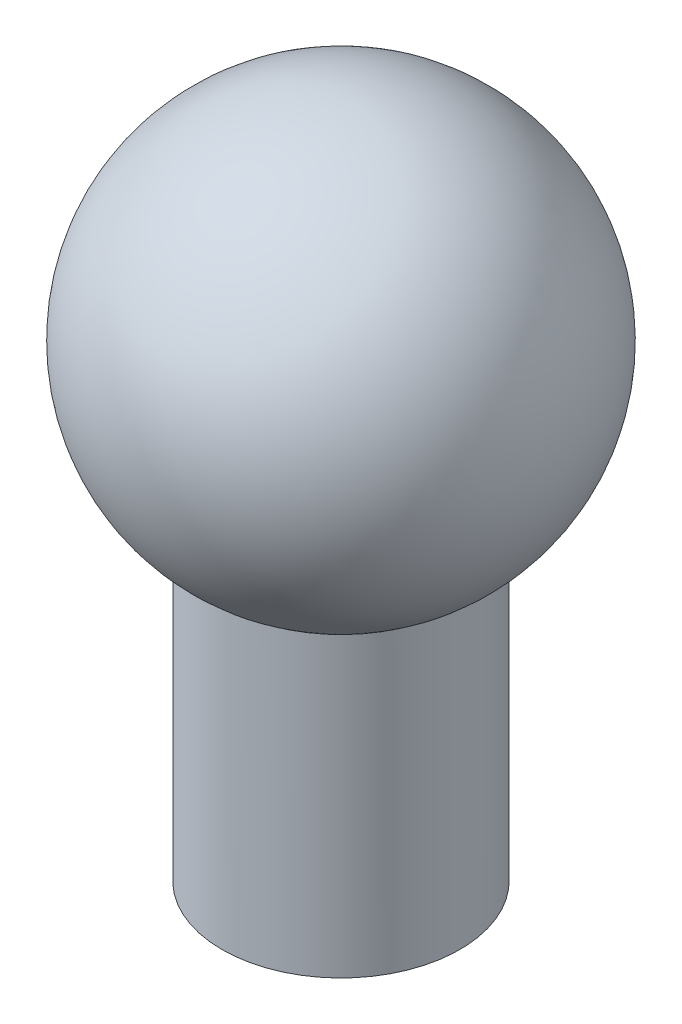
ISO-10303-21;
HEADER;
FILE_DESCRIPTION(('STEP AP214'),'2;1');
FILE_NAME('part.step','',(''),(''),'','','');
FILE_SCHEMA(('AUTOMOTIVE_DESIGN { 1 0 10303 214 1 1 1 1 }'));
ENDSEC;
DATA;
#1=APPLICATION_CONTEXT('core data for automotive mechanical design processes');
#2=APPLICATION_PROTOCOL_DEFINITION('international standard','automotive_design',2000,#1);
#3=PRODUCT_CONTEXT('',#1,'mechanical');
#4=PRODUCT('Part','Part','',(#3));
#5=PRODUCT_RELATED_PRODUCT_CATEGORY('part','',(#4));
#6=PRODUCT_DEFINITION_FORMATION('','',#4);
#7=PRODUCT_DEFINITION_CONTEXT('part definition',#1,'design');
#8=PRODUCT_DEFINITION('design','',#6,#7);
#9=PRODUCT_DEFINITION_SHAPE('','',#8);
#10=(LENGTH_UNIT() NAMED_UNIT(*) SI_UNIT(.MILLI.,.METRE.));
#11=(NAMED_UNIT(*) PLANE_ANGLE_UNIT() SI_UNIT($,.RADIAN.));
#12=(NAMED_UNIT(*) SI_UNIT($,.STERADIAN.) SOLID_ANGLE_UNIT());
#13=UNCERTAINTY_MEASURE_WITH_UNIT(LENGTH_MEASURE(1.E-05),#10,'distance_accuracy_value','');
#14=(GEOMETRIC_REPRESENTATION_CONTEXT(3) GLOBAL_UNCERTAINTY_ASSIGNED_CONTEXT((#13)) GLOBAL_UNIT_ASSIGNED_CONTEXT((#10,
#11,#12)) REPRESENTATION_CONTEXT('',''));
#15=CARTESIAN_POINT('',(0.,0.,0.));
#16=DIRECTION('',(0.,0.,1.));
#17=DIRECTION('',(1.,0.,0.));
#18=AXIS2_PLACEMENT_3D('',#15,#16,#17);
#19=CARTESIAN_POINT('',(0.,15.744562646538,0.));
#20=DIRECTION('',(0.,-1.,0.));
#21=DIRECTION('',(1.,0.,0.));
#22=AXIS2_PLACEMENT_3D('',#19,#20,#21);
#23=SPHERICAL_SURFACE('',#22,7.);
#24=CARTESIAN_POINT('',(0.,10.,0.));
#25=DIRECTION('',(0.,-1.,0.));
#26=DIRECTION('',(0.,0.,-1.));
#27=AXIS2_PLACEMENT_3D('',#24,#25,#26);
#28=CIRCLE('',#27,4.);
#29=CARTESIAN_POINT('',(0.,10.,-4.));
#30=VERTEX_POINT('',#29);
#31=EDGE_CURVE('E10',#30,#30,#28,.T.);
#32=ORIENTED_EDGE('',*,*,#31,.F.);
#33=EDGE_LOOP('',(#32));
#34=FACE_BOUND('',#33,.T.);
#35=ADVANCED_FACE('F37',(#34),#23,.T.);
#36=CARTESIAN_POINT('',(0.,0.,0.));
#37=DIRECTION('',(0.,-1.,0.));
#38=DIRECTION('',(0.,0.,-1.));
#39=AXIS2_PLACEMENT_3D('',#36,#37,#38);
#40=CYLINDRICAL_SURFACE('',#39,4.);
#41=ORIENTED_EDGE('',*,*,#31,.T.);
#42=EDGE_LOOP('',(#41));
#43=FACE_BOUND('',#42,.T.);
#44=CARTESIAN_POINT('',(0.,0.,0.));
#45=DIRECTION('',(0.,-1.,0.));
#46=DIRECTION('',(0.,0.,-1.));
#47=AXIS2_PLACEMENT_3D('',#44,#45,#46);
#48=CIRCLE('',#47,4.);
#49=CARTESIAN_POINT('',(0.,0.,-4.));
#50=VERTEX_POINT('',#49);
#51=EDGE_CURVE('E44',#50,#50,#48,.T.);
#52=ORIENTED_EDGE('',*,*,#51,.F.);
#53=EDGE_LOOP('',(#52));
#54=FACE_BOUND('',#53,.T.);
#55=ADVANCED_FACE('F53',(#43,#54),#40,.T.);
#56=CARTESIAN_POINT('',(0.,0.,0.));
#57=DIRECTION('',(0.,-1.,0.));
#58=DIRECTION('',(0.,0.,-1.));
#59=AXIS2_PLACEMENT_3D('',#56,#57,#58);
#60=PLANE('',#59);
#61=ORIENTED_EDGE('',*,*,#51,.T.);
#62=EDGE_LOOP('',(#61));
#63=FACE_BOUND('',#62,.T.);
#64=ADVANCED_FACE('F51',(#63),#60,.T.);
#65=CLOSED_SHELL('',(#35,#55,#64));
#66=MANIFOLD_SOLID_BREP('B2',#65);
#67=ADVANCED_BREP_SHAPE_REPRESENTATION('',(#18,#66),#14);
#68=SHAPE_DEFINITION_REPRESENTATION(#9,#67);
ENDSEC;
END-ISO-10303-21;
